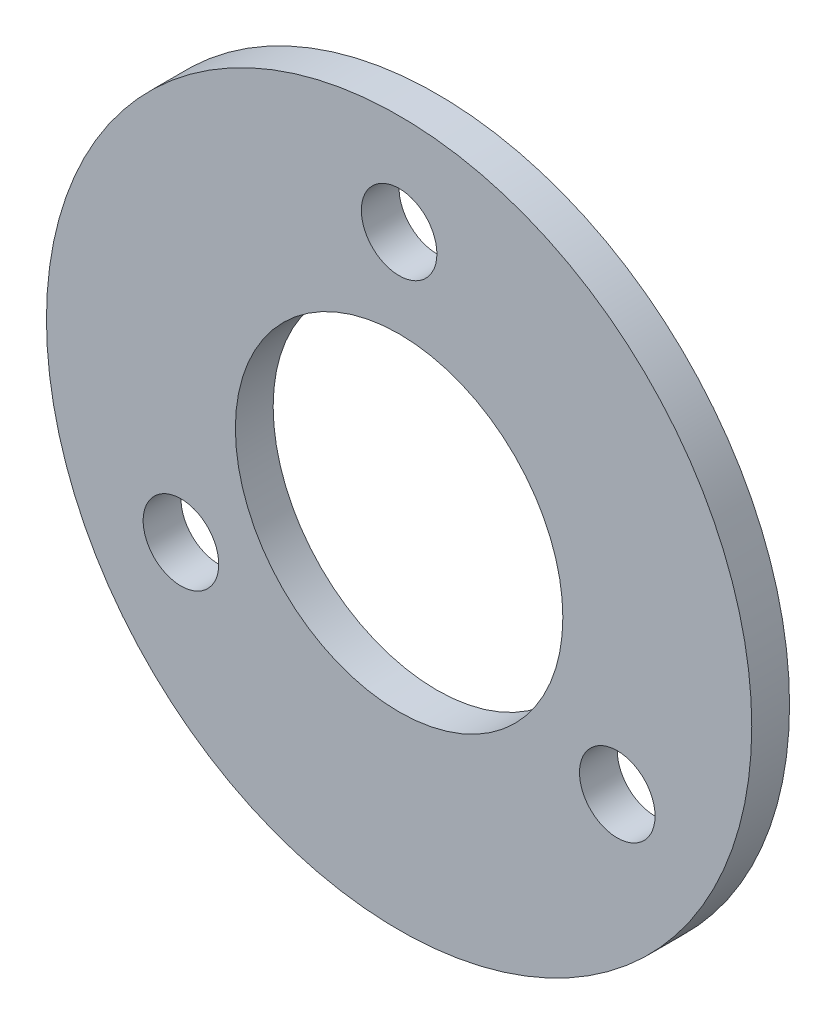
ISO-10303-21;
HEADER;
FILE_DESCRIPTION(('STEP AP214'),'2;1');
FILE_NAME('part.step','',(''),(''),'','','');
FILE_SCHEMA(('AUTOMOTIVE_DESIGN { 1 0 10303 214 1 1 1 1 }'));
ENDSEC;
DATA;
#1=APPLICATION_CONTEXT('core data for automotive mechanical design processes');
#2=APPLICATION_PROTOCOL_DEFINITION('international standard','automotive_design',2000,#1);
#3=PRODUCT_CONTEXT('',#1,'mechanical');
#4=PRODUCT('Part','Part','',(#3));
#5=PRODUCT_RELATED_PRODUCT_CATEGORY('part','',(#4));
#6=PRODUCT_DEFINITION_FORMATION('','',#4);
#7=PRODUCT_DEFINITION_CONTEXT('part definition',#1,'design');
#8=PRODUCT_DEFINITION('design','',#6,#7);
#9=PRODUCT_DEFINITION_SHAPE('','',#8);
#10=(LENGTH_UNIT() NAMED_UNIT(*) SI_UNIT(.MILLI.,.METRE.));
#11=(NAMED_UNIT(*) PLANE_ANGLE_UNIT() SI_UNIT($,.RADIAN.));
#12=(NAMED_UNIT(*) SI_UNIT($,.STERADIAN.) SOLID_ANGLE_UNIT());
#13=UNCERTAINTY_MEASURE_WITH_UNIT(LENGTH_MEASURE(1.E-05),#10,'distance_accuracy_value','');
#14=(GEOMETRIC_REPRESENTATION_CONTEXT(3) GLOBAL_UNCERTAINTY_ASSIGNED_CONTEXT((#13)) GLOBAL_UNIT_ASSIGNED_CONTEXT((#10,
#11,#12)) REPRESENTATION_CONTEXT('',''));
#15=CARTESIAN_POINT('',(0.,0.,0.));
#16=DIRECTION('',(0.,0.,1.));
#17=DIRECTION('',(1.,0.,0.));
#18=AXIS2_PLACEMENT_3D('',#15,#16,#17);
#19=CARTESIAN_POINT('',(0.,0.,1.5));
#20=DIRECTION('',(0.,0.,1.));
#21=DIRECTION('',(1.,0.,0.));
#22=AXIS2_PLACEMENT_3D('',#19,#20,#21);
#23=PLANE('',#22);
#24=CARTESIAN_POINT('',(0.,10.,1.5));
#25=DIRECTION('',(0.,0.,1.));
#26=DIRECTION('',(1.,0.,0.));
#27=AXIS2_PLACEMENT_3D('',#24,#25,#26);
#28=CIRCLE('',#27,1.5);
#29=CARTESIAN_POINT('',(1.5,10.,1.5));
#30=VERTEX_POINT('',#29);
#31=EDGE_CURVE('E52',#30,#30,#28,.T.);
#32=ORIENTED_EDGE('',*,*,#31,.F.);
#33=EDGE_LOOP('',(#32));
#34=FACE_BOUND('',#33,.T.);
#35=CARTESIAN_POINT('',(-8.66025403784436,-5.00000000000004,1.5));
#36=DIRECTION('',(0.,0.,1.));
#37=DIRECTION('',(1.,0.,0.));
#38=AXIS2_PLACEMENT_3D('',#35,#36,#37);
#39=CIRCLE('',#38,1.5);
#40=CARTESIAN_POINT('',(-7.16025403784436,-5.00000000000004,1.5));
#41=VERTEX_POINT('',#40);
#42=EDGE_CURVE('E41',#41,#41,#39,.T.);
#43=ORIENTED_EDGE('',*,*,#42,.F.);
#44=EDGE_LOOP('',(#43));
#45=FACE_BOUND('',#44,.T.);
#46=CARTESIAN_POINT('',(0.,0.,1.5));
#47=DIRECTION('',(0.,0.,1.));
#48=DIRECTION('',(1.,0.,0.));
#49=AXIS2_PLACEMENT_3D('',#46,#47,#48);
#50=CIRCLE('',#49,14.);
#51=CARTESIAN_POINT('',(14.,0.,1.5));
#52=VERTEX_POINT('',#51);
#53=EDGE_CURVE('E10',#52,#52,#50,.T.);
#54=ORIENTED_EDGE('',*,*,#53,.T.);
#55=EDGE_LOOP('',(#54));
#56=FACE_BOUND('',#55,.T.);
#57=CARTESIAN_POINT('',(8.66025403784436,-5.00000000000004,1.5));
#58=DIRECTION('',(0.,0.,1.));
#59=DIRECTION('',(1.,0.,0.));
#60=AXIS2_PLACEMENT_3D('',#57,#58,#59);
#61=CIRCLE('',#60,1.5);
#62=CARTESIAN_POINT('',(10.1602540378444,-5.00000000000004,1.5));
#63=VERTEX_POINT('',#62);
#64=EDGE_CURVE('E46',#63,#63,#61,.T.);
#65=ORIENTED_EDGE('',*,*,#64,.F.);
#66=EDGE_LOOP('',(#65));
#67=FACE_BOUND('',#66,.T.);
#68=CARTESIAN_POINT('',(0.,0.,1.5));
#69=DIRECTION('',(0.,0.,1.));
#70=DIRECTION('',(1.,0.,0.));
#71=AXIS2_PLACEMENT_3D('',#68,#69,#70);
#72=CIRCLE('',#71,6.5);
#73=CARTESIAN_POINT('',(6.5,0.,1.5));
#74=VERTEX_POINT('',#73);
#75=EDGE_CURVE('E58',#74,#74,#72,.T.);
#76=ORIENTED_EDGE('',*,*,#75,.F.);
#77=EDGE_LOOP('',(#76));
#78=FACE_BOUND('',#77,.T.);
#79=ADVANCED_FACE('F30',(#34,#45,#56,#67,#78),#23,.T.);
#80=CARTESIAN_POINT('',(0.,0.,0.));
#81=DIRECTION('',(0.,0.,1.));
#82=DIRECTION('',(1.,0.,0.));
#83=AXIS2_PLACEMENT_3D('',#80,#81,#82);
#84=PLANE('',#83);
#85=CARTESIAN_POINT('',(0.,10.,0.));
#86=DIRECTION('',(0.,0.,1.));
#87=DIRECTION('',(1.,0.,0.));
#88=AXIS2_PLACEMENT_3D('',#85,#86,#87);
#89=CIRCLE('',#88,1.5);
#90=CARTESIAN_POINT('',(1.5,10.,0.));
#91=VERTEX_POINT('',#90);
#92=EDGE_CURVE('E55',#91,#91,#89,.T.);
#93=ORIENTED_EDGE('',*,*,#92,.T.);
#94=EDGE_LOOP('',(#93));
#95=FACE_BOUND('',#94,.T.);
#96=CARTESIAN_POINT('',(-8.66025403784436,-5.00000000000004,0.));
#97=DIRECTION('',(0.,0.,1.));
#98=DIRECTION('',(1.,0.,0.));
#99=AXIS2_PLACEMENT_3D('',#96,#97,#98);
#100=CIRCLE('',#99,1.5);
#101=CARTESIAN_POINT('',(-7.16025403784436,-5.00000000000004,0.));
#102=VERTEX_POINT('',#101);
#103=EDGE_CURVE('E43',#102,#102,#100,.T.);
#104=ORIENTED_EDGE('',*,*,#103,.T.);
#105=EDGE_LOOP('',(#104));
#106=FACE_BOUND('',#105,.T.);
#107=CARTESIAN_POINT('',(0.,0.,0.));
#108=DIRECTION('',(0.,0.,1.));
#109=DIRECTION('',(1.,0.,0.));
#110=AXIS2_PLACEMENT_3D('',#107,#108,#109);
#111=CIRCLE('',#110,14.);
#112=CARTESIAN_POINT('',(14.,0.,0.));
#113=VERTEX_POINT('',#112);
#114=EDGE_CURVE('E34',#113,#113,#111,.T.);
#115=ORIENTED_EDGE('',*,*,#114,.F.);
#116=EDGE_LOOP('',(#115));
#117=FACE_BOUND('',#116,.T.);
#118=CARTESIAN_POINT('',(8.66025403784436,-5.00000000000004,0.));
#119=DIRECTION('',(0.,0.,1.));
#120=DIRECTION('',(1.,0.,0.));
#121=AXIS2_PLACEMENT_3D('',#118,#119,#120);
#122=CIRCLE('',#121,1.5);
#123=CARTESIAN_POINT('',(10.1602540378444,-5.00000000000004,0.));
#124=VERTEX_POINT('',#123);
#125=EDGE_CURVE('E49',#124,#124,#122,.T.);
#126=ORIENTED_EDGE('',*,*,#125,.T.);
#127=EDGE_LOOP('',(#126));
#128=FACE_BOUND('',#127,.T.);
#129=CARTESIAN_POINT('',(0.,0.,0.));
#130=DIRECTION('',(0.,0.,1.));
#131=DIRECTION('',(1.,0.,0.));
#132=AXIS2_PLACEMENT_3D('',#129,#130,#131);
#133=CIRCLE('',#132,6.5);
#134=CARTESIAN_POINT('',(6.5,0.,0.));
#135=VERTEX_POINT('',#134);
#136=EDGE_CURVE('E61',#135,#135,#133,.T.);
#137=ORIENTED_EDGE('',*,*,#136,.T.);
#138=EDGE_LOOP('',(#137));
#139=FACE_BOUND('',#138,.T.);
#140=ADVANCED_FACE('F71',(#95,#106,#117,#128,#139),#84,.F.);
#141=CARTESIAN_POINT('',(0.,0.,1.5));
#142=DIRECTION('',(0.,0.,-1.));
#143=DIRECTION('',(-1.,0.,0.));
#144=AXIS2_PLACEMENT_3D('',#141,#142,#143);
#145=CYLINDRICAL_SURFACE('',#144,14.);
#146=ORIENTED_EDGE('',*,*,#53,.F.);
#147=EDGE_LOOP('',(#146));
#148=FACE_BOUND('',#147,.T.);
#149=ORIENTED_EDGE('',*,*,#114,.T.);
#150=EDGE_LOOP('',(#149));
#151=FACE_BOUND('',#150,.T.);
#152=ADVANCED_FACE('F32',(#148,#151),#145,.T.);
#153=CARTESIAN_POINT('',(-8.66025403784436,-5.00000000000004,1.5));
#154=DIRECTION('',(0.,0.,-1.));
#155=DIRECTION('',(-1.,0.,0.));
#156=AXIS2_PLACEMENT_3D('',#153,#154,#155);
#157=CYLINDRICAL_SURFACE('',#156,1.5);
#158=ORIENTED_EDGE('',*,*,#42,.T.);
#159=EDGE_LOOP('',(#158));
#160=FACE_BOUND('',#159,.T.);
#161=ORIENTED_EDGE('',*,*,#103,.F.);
#162=EDGE_LOOP('',(#161));
#163=FACE_BOUND('',#162,.T.);
#164=ADVANCED_FACE('F81',(#160,#163),#157,.F.);
#165=CARTESIAN_POINT('',(8.66025403784436,-5.00000000000004,1.5));
#166=DIRECTION('',(0.,0.,-1.));
#167=DIRECTION('',(-1.,0.,0.));
#168=AXIS2_PLACEMENT_3D('',#165,#166,#167);
#169=CYLINDRICAL_SURFACE('',#168,1.5);
#170=ORIENTED_EDGE('',*,*,#64,.T.);
#171=EDGE_LOOP('',(#170));
#172=FACE_BOUND('',#171,.T.);
#173=ORIENTED_EDGE('',*,*,#125,.F.);
#174=EDGE_LOOP('',(#173));
#175=FACE_BOUND('',#174,.T.);
#176=ADVANCED_FACE('F84',(#172,#175),#169,.F.);
#177=CARTESIAN_POINT('',(0.,10.,1.5));
#178=DIRECTION('',(0.,0.,-1.));
#179=DIRECTION('',(-1.,0.,0.));
#180=AXIS2_PLACEMENT_3D('',#177,#178,#179);
#181=CYLINDRICAL_SURFACE('',#180,1.5);
#182=ORIENTED_EDGE('',*,*,#31,.T.);
#183=EDGE_LOOP('',(#182));
#184=FACE_BOUND('',#183,.T.);
#185=ORIENTED_EDGE('',*,*,#92,.F.);
#186=EDGE_LOOP('',(#185));
#187=FACE_BOUND('',#186,.T.);
#188=ADVANCED_FACE('F88',(#184,#187),#181,.F.);
#189=CARTESIAN_POINT('',(0.,0.,1.5));
#190=DIRECTION('',(0.,0.,-1.));
#191=DIRECTION('',(-1.,0.,0.));
#192=AXIS2_PLACEMENT_3D('',#189,#190,#191);
#193=CYLINDRICAL_SURFACE('',#192,6.5);
#194=ORIENTED_EDGE('',*,*,#75,.T.);
#195=EDGE_LOOP('',(#194));
#196=FACE_BOUND('',#195,.T.);
#197=ORIENTED_EDGE('',*,*,#136,.F.);
#198=EDGE_LOOP('',(#197));
#199=FACE_BOUND('',#198,.T.);
#200=ADVANCED_FACE('F67',(#196,#199),#193,.F.);
#201=CLOSED_SHELL('',(#79,#140,#152,#164,#176,#188,#200));
#202=MANIFOLD_SOLID_BREP('B2',#201);
#203=ADVANCED_BREP_SHAPE_REPRESENTATION('',(#18,#202),#14);
#204=SHAPE_DEFINITION_REPRESENTATION(#9,#203);
ENDSEC;
END-ISO-10303-21;
